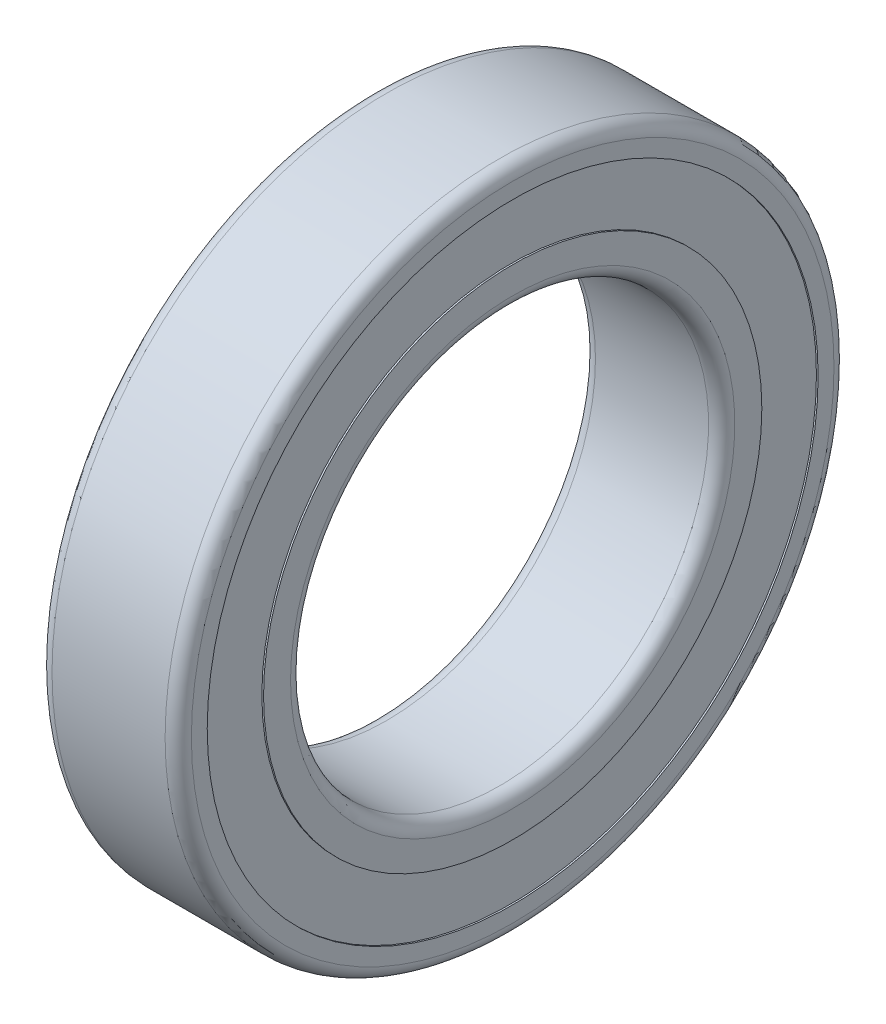
ISO-10303-21;
HEADER;
FILE_DESCRIPTION(('STEP AP214'),'2;1');
FILE_NAME('part.step','',(''),(''),'','','');
FILE_SCHEMA(('AUTOMOTIVE_DESIGN { 1 0 10303 214 1 1 1 1 }'));
ENDSEC;
DATA;
#1=APPLICATION_CONTEXT('core data for automotive mechanical design processes');
#2=APPLICATION_PROTOCOL_DEFINITION('international standard','automotive_design',2000,#1);
#3=PRODUCT_CONTEXT('',#1,'mechanical');
#4=PRODUCT('Part','Part','',(#3));
#5=PRODUCT_RELATED_PRODUCT_CATEGORY('part','',(#4));
#6=PRODUCT_DEFINITION_FORMATION('','',#4);
#7=PRODUCT_DEFINITION_CONTEXT('part definition',#1,'design');
#8=PRODUCT_DEFINITION('design','',#6,#7);
#9=PRODUCT_DEFINITION_SHAPE('','',#8);
#10=(LENGTH_UNIT() NAMED_UNIT(*) SI_UNIT(.MILLI.,.METRE.));
#11=(NAMED_UNIT(*) PLANE_ANGLE_UNIT() SI_UNIT($,.RADIAN.));
#12=(NAMED_UNIT(*) SI_UNIT($,.STERADIAN.) SOLID_ANGLE_UNIT());
#13=UNCERTAINTY_MEASURE_WITH_UNIT(LENGTH_MEASURE(1.E-05),#10,'distance_accuracy_value','');
#14=(GEOMETRIC_REPRESENTATION_CONTEXT(3) GLOBAL_UNCERTAINTY_ASSIGNED_CONTEXT((#13)) GLOBAL_UNIT_ASSIGNED_CONTEXT((#10,
#11,#12)) REPRESENTATION_CONTEXT('',''));
#15=CARTESIAN_POINT('',(0.,0.,0.));
#16=DIRECTION('',(0.,0.,1.));
#17=DIRECTION('',(1.,0.,0.));
#18=AXIS2_PLACEMENT_3D('',#15,#16,#17);
#19=CARTESIAN_POINT('',(0.,8.63319625011885,4.53105092742663));
#20=DIRECTION('',(-1.,0.,0.));
#21=DIRECTION('',(0.,0.885456025653216,0.464723172043757));
#22=AXIS2_PLACEMENT_3D('',#19,#20,#21);
#23=SPHERICAL_SURFACE('',#22,1.3275);
#24=CARTESIAN_POINT('',(-1.3275,8.63319625011885,4.53105092742663));
#25=VERTEX_POINT('',#24);
#26=VERTEX_LOOP('',#25);
#27=FACE_BOUND('',#26,.T.);
#28=ADVANCED_FACE('F39',(#27),#23,.T.);
#29=CLOSED_SHELL('',(#28));
#30=MANIFOLD_SOLID_BREP('B2',#29);
#31=CARTESIAN_POINT('',(0.,5.53863128062887,8.02409269246308));
#32=DIRECTION('',(-1.,0.,0.));
#33=DIRECTION('',(0.,0.568064746731166,0.822983865893649));
#34=AXIS2_PLACEMENT_3D('',#31,#32,#33);
#35=SPHERICAL_SURFACE('',#34,1.3275);
#36=CARTESIAN_POINT('',(-1.3275,5.53863128062887,8.02409269246308));
#37=VERTEX_POINT('',#36);
#38=VERTEX_LOOP('',#37);
#39=FACE_BOUND('',#38,.T.);
#40=ADVANCED_FACE('F57',(#39),#35,.T.);
#41=CLOSED_SHELL('',(#40));
#42=MANIFOLD_SOLID_BREP('B6',#41);
#43=CARTESIAN_POINT('',(0.,1.1752326324895,9.67891152245602));
#44=DIRECTION('',(-1.,0.,0.));
#45=DIRECTION('',(0.,0.120536680255334,0.992708874098053));
#46=AXIS2_PLACEMENT_3D('',#43,#44,#45);
#47=SPHERICAL_SURFACE('',#46,1.3275);
#48=CARTESIAN_POINT('',(-1.3275,1.1752326324895,9.67891152245602));
#49=VERTEX_POINT('',#48);
#50=VERTEX_LOOP('',#49);
#51=FACE_BOUND('',#50,.T.);
#52=ADVANCED_FACE('F75',(#51),#47,.T.);
#53=CLOSED_SHELL('',(#52));
#54=MANIFOLD_SOLID_BREP('B35',#53);
#55=CARTESIAN_POINT('',(0.,-3.45739764866464,9.11640836618283));
#56=DIRECTION('',(-1.,0.,0.));
#57=DIRECTION('',(0.,-0.354604887042527,0.935016242685418));
#58=AXIS2_PLACEMENT_3D('',#55,#56,#57);
#59=SPHERICAL_SURFACE('',#58,1.3275);
#60=CARTESIAN_POINT('',(-1.3275,-3.45739764866464,9.11640836618283));
#61=VERTEX_POINT('',#60);
#62=VERTEX_LOOP('',#61);
#63=FACE_BOUND('',#62,.T.);
#64=ADVANCED_FACE('F93',(#63),#59,.T.);
#65=CLOSED_SHELL('',(#64));
#66=MANIFOLD_SOLID_BREP('B53',#65);
#67=CARTESIAN_POINT('',(0.,-7.29797979466818,6.46544591784782));
#68=DIRECTION('',(-1.,0.,0.));
#69=DIRECTION('',(0.,-0.748510748171095,0.663122658240802));
#70=AXIS2_PLACEMENT_3D('',#67,#68,#69);
#71=SPHERICAL_SURFACE('',#70,1.3275);
#72=CARTESIAN_POINT('',(-1.3275,-7.29797979466818,6.46544591784782));
#73=VERTEX_POINT('',#72);
#74=VERTEX_LOOP('',#73);
#75=FACE_BOUND('',#74,.T.);
#76=ADVANCED_FACE('F111',(#75),#71,.T.);
#77=CLOSED_SHELL('',(#76));
#78=MANIFOLD_SOLID_BREP('B71',#77);
#79=CARTESIAN_POINT('',(0.,-9.46668271990399,2.33332772680376));
#80=DIRECTION('',(-1.,0.,0.));
#81=DIRECTION('',(0.,-0.97094181742605,0.239315664287565));
#82=AXIS2_PLACEMENT_3D('',#79,#80,#81);
#83=SPHERICAL_SURFACE('',#82,1.3275);
#84=CARTESIAN_POINT('',(-1.3275,-9.46668271990399,2.33332772680376));
#85=VERTEX_POINT('',#84);
#86=VERTEX_LOOP('',#85);
#87=FACE_BOUND('',#86,.T.);
#88=ADVANCED_FACE('F129',(#87),#83,.T.);
#89=CLOSED_SHELL('',(#88));
#90=MANIFOLD_SOLID_BREP('B89',#89);
#91=CARTESIAN_POINT('',(0.,-9.46668271990402,-2.33332772680363));
#92=DIRECTION('',(-1.,0.,0.));
#93=DIRECTION('',(0.,-0.970941817426054,-0.239315664287552));
#94=AXIS2_PLACEMENT_3D('',#91,#92,#93);
#95=SPHERICAL_SURFACE('',#94,1.3275);
#96=CARTESIAN_POINT('',(-1.3275,-9.46668271990402,-2.33332772680363));
#97=VERTEX_POINT('',#96);
#98=VERTEX_LOOP('',#97);
#99=FACE_BOUND('',#98,.T.);
#100=ADVANCED_FACE('F147',(#99),#95,.T.);
#101=CLOSED_SHELL('',(#100));
#102=MANIFOLD_SOLID_BREP('B107',#101);
#103=CARTESIAN_POINT('',(0.,-7.29797979466827,-6.46544591784771));
#104=DIRECTION('',(-1.,0.,0.));
#105=DIRECTION('',(0.,-0.748510748171105,-0.663122658240791));
#106=AXIS2_PLACEMENT_3D('',#103,#104,#105);
#107=SPHERICAL_SURFACE('',#106,1.3275);
#108=CARTESIAN_POINT('',(-1.3275,-7.29797979466827,-6.46544591784771));
#109=VERTEX_POINT('',#108);
#110=VERTEX_LOOP('',#109);
#111=FACE_BOUND('',#110,.T.);
#112=ADVANCED_FACE('F165',(#111),#107,.T.);
#113=CLOSED_SHELL('',(#112));
#114=MANIFOLD_SOLID_BREP('B125',#113);
#115=CARTESIAN_POINT('',(0.,-3.45739764866476,-9.11640836618278));
#116=DIRECTION('',(-1.,0.,0.));
#117=DIRECTION('',(0.,-0.35460488704254,-0.935016242685413));
#118=AXIS2_PLACEMENT_3D('',#115,#116,#117);
#119=SPHERICAL_SURFACE('',#118,1.3275);
#120=CARTESIAN_POINT('',(-1.3275,-3.45739764866476,-9.11640836618278));
#121=VERTEX_POINT('',#120);
#122=VERTEX_LOOP('',#121);
#123=FACE_BOUND('',#122,.T.);
#124=ADVANCED_FACE('F183',(#123),#119,.T.);
#125=CLOSED_SHELL('',(#124));
#126=MANIFOLD_SOLID_BREP('B143',#125);
#127=CARTESIAN_POINT('',(0.,1.17523263248937,-9.67891152245603));
#128=DIRECTION('',(-1.,0.,0.));
#129=DIRECTION('',(0.,0.12053668025532,-0.992708874098054));
#130=AXIS2_PLACEMENT_3D('',#127,#128,#129);
#131=SPHERICAL_SURFACE('',#130,1.3275);
#132=CARTESIAN_POINT('',(-1.3275,1.17523263248937,-9.67891152245603));
#133=VERTEX_POINT('',#132);
#134=VERTEX_LOOP('',#133);
#135=FACE_BOUND('',#134,.T.);
#136=ADVANCED_FACE('F201',(#135),#131,.T.);
#137=CLOSED_SHELL('',(#136));
#138=MANIFOLD_SOLID_BREP('B161',#137);
#139=CARTESIAN_POINT('',(0.,5.53863128062875,-8.02409269246316));
#140=DIRECTION('',(-1.,0.,0.));
#141=DIRECTION('',(0.,0.568064746731154,-0.822983865893658));
#142=AXIS2_PLACEMENT_3D('',#139,#140,#141);
#143=SPHERICAL_SURFACE('',#142,1.3275);
#144=CARTESIAN_POINT('',(-1.3275,5.53863128062875,-8.02409269246316));
#145=VERTEX_POINT('',#144);
#146=VERTEX_LOOP('',#145);
#147=FACE_BOUND('',#146,.T.);
#148=ADVANCED_FACE('F219',(#147),#143,.T.);
#149=CLOSED_SHELL('',(#148));
#150=MANIFOLD_SOLID_BREP('B179',#149);
#151=CARTESIAN_POINT('',(0.,8.63319625011879,-4.53105092742675));
#152=DIRECTION('',(-1.,0.,0.));
#153=DIRECTION('',(0.,0.885456025653209,-0.46472317204377));
#154=AXIS2_PLACEMENT_3D('',#151,#152,#153);
#155=SPHERICAL_SURFACE('',#154,1.3275);
#156=CARTESIAN_POINT('',(-1.3275,8.63319625011879,-4.53105092742675));
#157=VERTEX_POINT('',#156);
#158=VERTEX_LOOP('',#157);
#159=FACE_BOUND('',#158,.T.);
#160=ADVANCED_FACE('F237',(#159),#155,.T.);
#161=CLOSED_SHELL('',(#160));
#162=MANIFOLD_SOLID_BREP('B197',#161);
#163=CARTESIAN_POINT('',(0.,9.75,0.));
#164=DIRECTION('',(-1.,0.,0.));
#165=DIRECTION('',(0.,1.,0.));
#166=AXIS2_PLACEMENT_3D('',#163,#164,#165);
#167=SPHERICAL_SURFACE('',#166,1.3275);
#168=CARTESIAN_POINT('',(-1.3275,9.75,0.));
#169=VERTEX_POINT('',#168);
#170=VERTEX_LOOP('',#169);
#171=FACE_BOUND('',#170,.T.);
#172=ADVANCED_FACE('F257',(#171),#167,.T.);
#173=CLOSED_SHELL('',(#172));
#174=MANIFOLD_SOLID_BREP('B215',#173);
#175=CARTESIAN_POINT('',(-2.44,8.94,0.));
#176=DIRECTION('',(1.,0.,0.));
#177=DIRECTION('',(0.,0.,-1.));
#178=AXIS2_PLACEMENT_3D('',#175,#176,#177);
#179=PLANE('',#178);
#180=CARTESIAN_POINT('',(-2.44,0.,0.));
#181=DIRECTION('',(-1.,0.,0.));
#182=DIRECTION('',(0.,0.,1.));
#183=AXIS2_PLACEMENT_3D('',#180,#181,#182);
#184=CIRCLE('',#183,8.94);
#185=CARTESIAN_POINT('',(-2.44,0.,8.94));
#186=VERTEX_POINT('',#185);
#187=EDGE_CURVE('E291',#186,#186,#184,.T.);
#188=ORIENTED_EDGE('',*,*,#187,.F.);
#189=EDGE_LOOP('',(#188));
#190=FACE_BOUND('',#189,.T.);
#191=CARTESIAN_POINT('',(-2.44,0.,0.));
#192=DIRECTION('',(-1.,0.,0.));
#193=DIRECTION('',(0.,0.,1.));
#194=AXIS2_PLACEMENT_3D('',#191,#192,#193);
#195=CIRCLE('',#194,10.96);
#196=CARTESIAN_POINT('',(-2.44,0.,10.96));
#197=VERTEX_POINT('',#196);
#198=EDGE_CURVE('E256',#197,#197,#195,.T.);
#199=ORIENTED_EDGE('',*,*,#198,.T.);
#200=EDGE_LOOP('',(#199));
#201=FACE_BOUND('',#200,.T.);
#202=ADVANCED_FACE('F277',(#190,#201),#179,.F.);
#203=CARTESIAN_POINT('',(0.,0.,0.));
#204=DIRECTION('',(-1.,0.,0.));
#205=DIRECTION('',(0.,0.,1.));
#206=AXIS2_PLACEMENT_3D('',#203,#204,#205);
#207=CYLINDRICAL_SURFACE('',#206,10.96);
#208=ORIENTED_EDGE('',*,*,#198,.F.);
#209=EDGE_LOOP('',(#208));
#210=FACE_BOUND('',#209,.T.);
#211=CARTESIAN_POINT('',(-2.27,0.,0.));
#212=DIRECTION('',(-1.,0.,0.));
#213=DIRECTION('',(0.,0.,1.));
#214=AXIS2_PLACEMENT_3D('',#211,#212,#213);
#215=CIRCLE('',#214,10.96);
#216=CARTESIAN_POINT('',(-2.27,0.,10.96));
#217=VERTEX_POINT('',#216);
#218=EDGE_CURVE('E283',#217,#217,#215,.T.);
#219=ORIENTED_EDGE('',*,*,#218,.T.);
#220=EDGE_LOOP('',(#219));
#221=FACE_BOUND('',#220,.T.);
#222=ADVANCED_FACE('F300',(#210,#221),#207,.T.);
#223=CARTESIAN_POINT('',(-2.27,10.96,0.));
#224=DIRECTION('',(-1.,0.,0.));
#225=DIRECTION('',(0.,0.,1.));
#226=AXIS2_PLACEMENT_3D('',#223,#224,#225);
#227=PLANE('',#226);
#228=ORIENTED_EDGE('',*,*,#218,.F.);
#229=EDGE_LOOP('',(#228));
#230=FACE_BOUND('',#229,.T.);
#231=CARTESIAN_POINT('',(-2.27,0.,0.));
#232=DIRECTION('',(-1.,0.,0.));
#233=DIRECTION('',(0.,0.,1.));
#234=AXIS2_PLACEMENT_3D('',#231,#232,#233);
#235=CIRCLE('',#234,8.94);
#236=CARTESIAN_POINT('',(-2.27,0.,8.94));
#237=VERTEX_POINT('',#236);
#238=EDGE_CURVE('E287',#237,#237,#235,.T.);
#239=ORIENTED_EDGE('',*,*,#238,.T.);
#240=EDGE_LOOP('',(#239));
#241=FACE_BOUND('',#240,.T.);
#242=ADVANCED_FACE('F304',(#230,#241),#227,.F.);
#243=CARTESIAN_POINT('',(0.,0.,0.));
#244=DIRECTION('',(-1.,0.,0.));
#245=DIRECTION('',(0.,0.,1.));
#246=AXIS2_PLACEMENT_3D('',#243,#244,#245);
#247=CYLINDRICAL_SURFACE('',#246,8.94);
#248=ORIENTED_EDGE('',*,*,#238,.F.);
#249=EDGE_LOOP('',(#248));
#250=FACE_BOUND('',#249,.T.);
#251=ORIENTED_EDGE('',*,*,#187,.T.);
#252=EDGE_LOOP('',(#251));
#253=FACE_BOUND('',#252,.T.);
#254=ADVANCED_FACE('F297',(#250,#253),#247,.F.);
#255=CLOSED_SHELL('',(#202,#222,#242,#254));
#256=MANIFOLD_SOLID_BREP('B233',#255);
#257=CARTESIAN_POINT('',(0.,0.,0.));
#258=DIRECTION('',(-1.,0.,0.));
#259=DIRECTION('',(0.,0.,1.));
#260=AXIS2_PLACEMENT_3D('',#257,#258,#259);
#261=CYLINDRICAL_SURFACE('',#260,10.96);
#262=CARTESIAN_POINT('',(2.27,0.,0.));
#263=DIRECTION('',(-1.,0.,0.));
#264=DIRECTION('',(0.,0.,1.));
#265=AXIS2_PLACEMENT_3D('',#262,#263,#264);
#266=CIRCLE('',#265,10.96);
#267=CARTESIAN_POINT('',(2.27,0.,10.96));
#268=VERTEX_POINT('',#267);
#269=EDGE_CURVE('E276',#268,#268,#266,.T.);
#270=ORIENTED_EDGE('',*,*,#269,.F.);
#271=EDGE_LOOP('',(#270));
#272=FACE_BOUND('',#271,.T.);
#273=CARTESIAN_POINT('',(2.44,0.,0.));
#274=DIRECTION('',(-1.,0.,0.));
#275=DIRECTION('',(0.,0.,1.));
#276=AXIS2_PLACEMENT_3D('',#273,#274,#275);
#277=CIRCLE('',#276,10.96);
#278=CARTESIAN_POINT('',(2.44,0.,10.96));
#279=VERTEX_POINT('',#278);
#280=EDGE_CURVE('E364',#279,#279,#277,.T.);
#281=ORIENTED_EDGE('',*,*,#280,.T.);
#282=EDGE_LOOP('',(#281));
#283=FACE_BOUND('',#282,.T.);
#284=ADVANCED_FACE('F350',(#272,#283),#261,.T.);
#285=CARTESIAN_POINT('',(2.27,10.96,0.));
#286=DIRECTION('',(1.,0.,0.));
#287=DIRECTION('',(0.,0.,-1.));
#288=AXIS2_PLACEMENT_3D('',#285,#286,#287);
#289=PLANE('',#288);
#290=CARTESIAN_POINT('',(2.27,0.,0.));
#291=DIRECTION('',(-1.,0.,0.));
#292=DIRECTION('',(0.,0.,1.));
#293=AXIS2_PLACEMENT_3D('',#290,#291,#292);
#294=CIRCLE('',#293,8.94);
#295=CARTESIAN_POINT('',(2.27,0.,8.94));
#296=VERTEX_POINT('',#295);
#297=EDGE_CURVE('E356',#296,#296,#294,.T.);
#298=ORIENTED_EDGE('',*,*,#297,.F.);
#299=EDGE_LOOP('',(#298));
#300=FACE_BOUND('',#299,.T.);
#301=ORIENTED_EDGE('',*,*,#269,.T.);
#302=EDGE_LOOP('',(#301));
#303=FACE_BOUND('',#302,.T.);
#304=ADVANCED_FACE('F379',(#300,#303),#289,.F.);
#305=CARTESIAN_POINT('',(0.,0.,0.));
#306=DIRECTION('',(-1.,0.,0.));
#307=DIRECTION('',(0.,0.,1.));
#308=AXIS2_PLACEMENT_3D('',#305,#306,#307);
#309=CYLINDRICAL_SURFACE('',#308,8.94);
#310=CARTESIAN_POINT('',(2.44,0.,0.));
#311=DIRECTION('',(-1.,0.,0.));
#312=DIRECTION('',(0.,0.,1.));
#313=AXIS2_PLACEMENT_3D('',#310,#311,#312);
#314=CIRCLE('',#313,8.94);
#315=CARTESIAN_POINT('',(2.44,0.,8.94));
#316=VERTEX_POINT('',#315);
#317=EDGE_CURVE('E360',#316,#316,#314,.T.);
#318=ORIENTED_EDGE('',*,*,#317,.F.);
#319=EDGE_LOOP('',(#318));
#320=FACE_BOUND('',#319,.T.);
#321=ORIENTED_EDGE('',*,*,#297,.T.);
#322=EDGE_LOOP('',(#321));
#323=FACE_BOUND('',#322,.T.);
#324=ADVANCED_FACE('F374',(#320,#323),#309,.F.);
#325=CARTESIAN_POINT('',(2.44,8.94,0.));
#326=DIRECTION('',(-1.,0.,0.));
#327=DIRECTION('',(0.,0.,1.));
#328=AXIS2_PLACEMENT_3D('',#325,#326,#327);
#329=PLANE('',#328);
#330=ORIENTED_EDGE('',*,*,#280,.F.);
#331=EDGE_LOOP('',(#330));
#332=FACE_BOUND('',#331,.T.);
#333=ORIENTED_EDGE('',*,*,#317,.T.);
#334=EDGE_LOOP('',(#333));
#335=FACE_BOUND('',#334,.T.);
#336=ADVANCED_FACE('F371',(#332,#335),#329,.F.);
#337=CLOSED_SHELL('',(#284,#304,#324,#336));
#338=MANIFOLD_SOLID_BREP('B251',#337);
#339=CARTESIAN_POINT('',(0.,0.,0.));
#340=DIRECTION('',(-1.,0.,0.));
#341=DIRECTION('',(0.,0.,1.));
#342=AXIS2_PLACEMENT_3D('',#339,#340,#341);
#343=TOROIDAL_SURFACE('',#342,9.75,1.35);
#344=CARTESIAN_POINT('',(-1.08,0.,0.));
#345=DIRECTION('',(-1.,0.,0.));
#346=DIRECTION('',(0.,0.,1.));
#347=AXIS2_PLACEMENT_3D('',#344,#345,#346);
#348=CIRCLE('',#347,8.94);
#349=CARTESIAN_POINT('',(-1.08,0.,8.94));
#350=VERTEX_POINT('',#349);
#351=EDGE_CURVE('E442',#350,#350,#348,.T.);
#352=ORIENTED_EDGE('',*,*,#351,.F.);
#353=EDGE_LOOP('',(#352));
#354=FACE_BOUND('',#353,.T.);
#355=CARTESIAN_POINT('',(1.08,0.,0.));
#356=DIRECTION('',(-1.,0.,0.));
#357=DIRECTION('',(0.,0.,1.));
#358=AXIS2_PLACEMENT_3D('',#355,#356,#357);
#359=CIRCLE('',#358,8.94);
#360=CARTESIAN_POINT('',(1.08,0.,8.94));
#361=VERTEX_POINT('',#360);
#362=EDGE_CURVE('E451',#361,#361,#359,.T.);
#363=ORIENTED_EDGE('',*,*,#362,.T.);
#364=EDGE_LOOP('',(#363));
#365=FACE_BOUND('',#364,.T.);
#366=ADVANCED_FACE('F422',(#354,#365),#343,.F.);
#367=CARTESIAN_POINT('',(0.,0.,0.));
#368=DIRECTION('',(-1.,0.,0.));
#369=DIRECTION('',(0.,0.,1.));
#370=AXIS2_PLACEMENT_3D('',#367,#368,#369);
#371=CYLINDRICAL_SURFACE('',#370,8.94);
#372=CARTESIAN_POINT('',(-2.5,0.,0.));
#373=DIRECTION('',(-1.,0.,0.));
#374=DIRECTION('',(0.,0.,1.));
#375=AXIS2_PLACEMENT_3D('',#372,#373,#374);
#376=CIRCLE('',#375,8.94);
#377=CARTESIAN_POINT('',(-2.5,0.,8.94));
#378=VERTEX_POINT('',#377);
#379=EDGE_CURVE('E445',#378,#378,#376,.T.);
#380=ORIENTED_EDGE('',*,*,#379,.F.);
#381=EDGE_LOOP('',(#380));
#382=FACE_BOUND('',#381,.T.);
#383=ORIENTED_EDGE('',*,*,#351,.T.);
#384=EDGE_LOOP('',(#383));
#385=FACE_BOUND('',#384,.T.);
#386=ADVANCED_FACE('F474',(#382,#385),#371,.T.);
#387=CARTESIAN_POINT('',(-2.5,8.94,0.));
#388=DIRECTION('',(1.,0.,0.));
#389=DIRECTION('',(0.,0.,-1.));
#390=AXIS2_PLACEMENT_3D('',#387,#388,#389);
#391=PLANE('',#390);
#392=CARTESIAN_POINT('',(-2.5,0.,0.));
#393=DIRECTION('',(1.,0.,0.));
#394=DIRECTION('',(0.,0.,-1.));
#395=AXIS2_PLACEMENT_3D('',#392,#393,#394);
#396=CIRCLE('',#395,7.9712);
#397=CARTESIAN_POINT('',(-2.5,0.,-7.9712));
#398=VERTEX_POINT('',#397);
#399=EDGE_CURVE('E429',#398,#398,#396,.T.);
#400=ORIENTED_EDGE('',*,*,#399,.T.);
#401=EDGE_LOOP('',(#400));
#402=FACE_BOUND('',#401,.T.);
#403=ORIENTED_EDGE('',*,*,#379,.T.);
#404=EDGE_LOOP('',(#403));
#405=FACE_BOUND('',#404,.T.);
#406=ADVANCED_FACE('F470',(#402,#405),#391,.F.);
#407=CARTESIAN_POINT('',(0.,0.,0.));
#408=DIRECTION('',(-1.,0.,0.));
#409=DIRECTION('',(0.,0.,1.));
#410=AXIS2_PLACEMENT_3D('',#407,#408,#409);
#411=CYLINDRICAL_SURFACE('',#410,7.5);
#412=CARTESIAN_POINT('',(-2.0288,0.,-3.33066907387547E-13));
#413=DIRECTION('',(1.,0.,0.));
#414=DIRECTION('',(0.,0.,-1.));
#415=AXIS2_PLACEMENT_3D('',#412,#413,#414);
#416=CIRCLE('',#415,7.5);
#417=CARTESIAN_POINT('',(-2.0288,0.,-7.50000000000033));
#418=VERTEX_POINT('',#417);
#419=EDGE_CURVE('E433',#418,#418,#416,.F.);
#420=ORIENTED_EDGE('',*,*,#419,.T.);
#421=EDGE_LOOP('',(#420));
#422=FACE_BOUND('',#421,.T.);
#423=CARTESIAN_POINT('',(2.0288,0.,0.));
#424=DIRECTION('',(-1.,0.,0.));
#425=DIRECTION('',(0.,0.,1.));
#426=AXIS2_PLACEMENT_3D('',#423,#424,#425);
#427=CIRCLE('',#426,7.5);
#428=CARTESIAN_POINT('',(2.0288,0.,7.5));
#429=VERTEX_POINT('',#428);
#430=EDGE_CURVE('E437',#429,#429,#427,.F.);
#431=ORIENTED_EDGE('',*,*,#430,.T.);
#432=EDGE_LOOP('',(#431));
#433=FACE_BOUND('',#432,.T.);
#434=ADVANCED_FACE('F465',(#422,#433),#411,.F.);
#435=CARTESIAN_POINT('',(2.5,8.94,0.));
#436=DIRECTION('',(-1.,0.,0.));
#437=DIRECTION('',(0.,0.,1.));
#438=AXIS2_PLACEMENT_3D('',#435,#436,#437);
#439=PLANE('',#438);
#440=CARTESIAN_POINT('',(2.5,0.,0.));
#441=DIRECTION('',(-1.,0.,0.));
#442=DIRECTION('',(0.,0.,1.));
#443=AXIS2_PLACEMENT_3D('',#440,#441,#442);
#444=CIRCLE('',#443,7.9712);
#445=CARTESIAN_POINT('',(2.5,0.,7.9712));
#446=VERTEX_POINT('',#445);
#447=EDGE_CURVE('E349',#446,#446,#444,.T.);
#448=ORIENTED_EDGE('',*,*,#447,.T.);
#449=EDGE_LOOP('',(#448));
#450=FACE_BOUND('',#449,.T.);
#451=CARTESIAN_POINT('',(2.5,0.,0.));
#452=DIRECTION('',(-1.,0.,0.));
#453=DIRECTION('',(0.,0.,1.));
#454=AXIS2_PLACEMENT_3D('',#451,#452,#453);
#455=CIRCLE('',#454,8.94);
#456=CARTESIAN_POINT('',(2.5,0.,8.94));
#457=VERTEX_POINT('',#456);
#458=EDGE_CURVE('E448',#457,#457,#455,.T.);
#459=ORIENTED_EDGE('',*,*,#458,.F.);
#460=EDGE_LOOP('',(#459));
#461=FACE_BOUND('',#460,.T.);
#462=ADVANCED_FACE('F460',(#450,#461),#439,.F.);
#463=CARTESIAN_POINT('',(0.,0.,0.));
#464=DIRECTION('',(-1.,0.,0.));
#465=DIRECTION('',(0.,0.,1.));
#466=AXIS2_PLACEMENT_3D('',#463,#464,#465);
#467=CYLINDRICAL_SURFACE('',#466,8.94);
#468=ORIENTED_EDGE('',*,*,#362,.F.);
#469=EDGE_LOOP('',(#468));
#470=FACE_BOUND('',#469,.T.);
#471=ORIENTED_EDGE('',*,*,#458,.T.);
#472=EDGE_LOOP('',(#471));
#473=FACE_BOUND('',#472,.T.);
#474=ADVANCED_FACE('F456',(#470,#473),#467,.T.);
#475=CARTESIAN_POINT('',(-2.0288,0.,-3.33066907387547E-13));
#476=DIRECTION('',(1.,0.,0.));
#477=DIRECTION('',(0.,0.,-1.));
#478=AXIS2_PLACEMENT_3D('',#475,#476,#477);
#479=TOROIDAL_SURFACE('',#478,7.9712,0.4712);
#480=ORIENTED_EDGE('',*,*,#399,.F.);
#481=EDGE_LOOP('',(#480));
#482=FACE_BOUND('',#481,.T.);
#483=ORIENTED_EDGE('',*,*,#419,.F.);
#484=EDGE_LOOP('',(#483));
#485=FACE_BOUND('',#484,.T.);
#486=ADVANCED_FACE('F459',(#482,#485),#479,.T.);
#487=CARTESIAN_POINT('',(2.0288,0.,0.));
#488=DIRECTION('',(-1.,0.,0.));
#489=DIRECTION('',(0.,0.,1.));
#490=AXIS2_PLACEMENT_3D('',#487,#488,#489);
#491=TOROIDAL_SURFACE('',#490,7.9712,0.4712);
#492=ORIENTED_EDGE('',*,*,#430,.F.);
#493=EDGE_LOOP('',(#492));
#494=FACE_BOUND('',#493,.T.);
#495=ORIENTED_EDGE('',*,*,#447,.F.);
#496=EDGE_LOOP('',(#495));
#497=FACE_BOUND('',#496,.T.);
#498=ADVANCED_FACE('F424',(#494,#497),#491,.T.);
#499=CLOSED_SHELL('',(#366,#386,#406,#434,#462,#474,#486,#498));
#500=MANIFOLD_SOLID_BREP('B271',#499);
#501=CARTESIAN_POINT('',(-2.5,12.,0.));
#502=DIRECTION('',(1.,0.,0.));
#503=DIRECTION('',(0.,0.,-1.));
#504=AXIS2_PLACEMENT_3D('',#501,#502,#503);
#505=PLANE('',#504);
#506=CARTESIAN_POINT('',(-2.5,0.,0.));
#507=DIRECTION('',(1.,0.,0.));
#508=DIRECTION('',(0.,0.,-1.));
#509=AXIS2_PLACEMENT_3D('',#506,#507,#508);
#510=CIRCLE('',#509,11.5288);
#511=CARTESIAN_POINT('',(-2.5,0.,-11.5288));
#512=VERTEX_POINT('',#511);
#513=EDGE_CURVE('E421',#512,#512,#510,.F.);
#514=ORIENTED_EDGE('',*,*,#513,.T.);
#515=EDGE_LOOP('',(#514));
#516=FACE_BOUND('',#515,.T.);
#517=CARTESIAN_POINT('',(-2.5,0.,0.));
#518=DIRECTION('',(-1.,0.,0.));
#519=DIRECTION('',(0.,0.,1.));
#520=AXIS2_PLACEMENT_3D('',#517,#518,#519);
#521=CIRCLE('',#520,10.96);
#522=CARTESIAN_POINT('',(-2.5,0.,10.96));
#523=VERTEX_POINT('',#522);
#524=EDGE_CURVE('E563',#523,#523,#521,.T.);
#525=ORIENTED_EDGE('',*,*,#524,.F.);
#526=EDGE_LOOP('',(#525));
#527=FACE_BOUND('',#526,.T.);
#528=ADVANCED_FACE('F543',(#516,#527),#505,.F.);
#529=CARTESIAN_POINT('',(0.,0.,0.));
#530=DIRECTION('',(-1.,0.,0.));
#531=DIRECTION('',(0.,0.,1.));
#532=AXIS2_PLACEMENT_3D('',#529,#530,#531);
#533=CYLINDRICAL_SURFACE('',#532,10.96);
#534=CARTESIAN_POINT('',(-2.26999999999999,0.,-1.49880108324396E-12));
#535=DIRECTION('',(-1.,0.,0.));
#536=DIRECTION('',(0.,0.,1.));
#537=AXIS2_PLACEMENT_3D('',#534,#535,#536);
#538=CIRCLE('',#537,10.96);
#539=CARTESIAN_POINT('',(-2.26999999999999,0.,10.9599999999985));
#540=VERTEX_POINT('',#539);
#541=EDGE_CURVE('E566',#540,#540,#538,.T.);
#542=ORIENTED_EDGE('',*,*,#541,.F.);
#543=EDGE_LOOP('',(#542));
#544=FACE_BOUND('',#543,.T.);
#545=ORIENTED_EDGE('',*,*,#524,.T.);
#546=EDGE_LOOP('',(#545));
#547=FACE_BOUND('',#546,.T.);
#548=ADVANCED_FACE('F623',(#544,#547),#533,.F.);
#549=CARTESIAN_POINT('',(-2.26999999999999,10.96,-1.49880108324396E-12));
#550=DIRECTION('',(1.,0.,0.));
#551=DIRECTION('',(0.,0.,-1.));
#552=AXIS2_PLACEMENT_3D('',#549,#550,#551);
#553=PLANE('',#552);
#554=CARTESIAN_POINT('',(-2.26999999999999,0.,-1.49880108324396E-12));
#555=DIRECTION('',(-1.,0.,0.));
#556=DIRECTION('',(0.,0.,1.));
#557=AXIS2_PLACEMENT_3D('',#554,#555,#556);
#558=CIRCLE('',#557,10.56);
#559=CARTESIAN_POINT('',(-2.26999999999999,0.,10.5599999999985));
#560=VERTEX_POINT('',#559);
#561=EDGE_CURVE('E569',#560,#560,#558,.T.);
#562=ORIENTED_EDGE('',*,*,#561,.F.);
#563=EDGE_LOOP('',(#562));
#564=FACE_BOUND('',#563,.T.);
#565=ORIENTED_EDGE('',*,*,#541,.T.);
#566=EDGE_LOOP('',(#565));
#567=FACE_BOUND('',#566,.T.);
#568=ADVANCED_FACE('F617',(#564,#567),#553,.F.);
#569=CARTESIAN_POINT('',(0.,0.,0.));
#570=DIRECTION('',(-1.,0.,0.));
#571=DIRECTION('',(0.,0.,1.));
#572=AXIS2_PLACEMENT_3D('',#569,#570,#571);
#573=CYLINDRICAL_SURFACE('',#572,10.56);
#574=CARTESIAN_POINT('',(-1.08,0.,0.));
#575=DIRECTION('',(-1.,0.,0.));
#576=DIRECTION('',(0.,0.,1.));
#577=AXIS2_PLACEMENT_3D('',#574,#575,#576);
#578=CIRCLE('',#577,10.56);
#579=CARTESIAN_POINT('',(-1.08,0.,10.56));
#580=VERTEX_POINT('',#579);
#581=EDGE_CURVE('E572',#580,#580,#578,.T.);
#582=ORIENTED_EDGE('',*,*,#581,.F.);
#583=EDGE_LOOP('',(#582));
#584=FACE_BOUND('',#583,.T.);
#585=ORIENTED_EDGE('',*,*,#561,.T.);
#586=EDGE_LOOP('',(#585));
#587=FACE_BOUND('',#586,.T.);
#588=ADVANCED_FACE('F611',(#584,#587),#573,.F.);
#589=CARTESIAN_POINT('',(0.,0.,0.));
#590=DIRECTION('',(-1.,0.,0.));
#591=DIRECTION('',(0.,0.,1.));
#592=AXIS2_PLACEMENT_3D('',#589,#590,#591);
#593=TOROIDAL_SURFACE('',#592,9.75,1.35);
#594=CARTESIAN_POINT('',(1.08,0.,0.));
#595=DIRECTION('',(-1.,0.,0.));
#596=DIRECTION('',(0.,0.,1.));
#597=AXIS2_PLACEMENT_3D('',#594,#595,#596);
#598=CIRCLE('',#597,10.56);
#599=CARTESIAN_POINT('',(1.08,0.,10.56));
#600=VERTEX_POINT('',#599);
#601=EDGE_CURVE('E575',#600,#600,#598,.T.);
#602=ORIENTED_EDGE('',*,*,#601,.F.);
#603=EDGE_LOOP('',(#602));
#604=FACE_BOUND('',#603,.T.);
#605=ORIENTED_EDGE('',*,*,#581,.T.);
#606=EDGE_LOOP('',(#605));
#607=FACE_BOUND('',#606,.T.);
#608=ADVANCED_FACE('F605',(#604,#607),#593,.F.);
#609=CARTESIAN_POINT('',(0.,0.,0.));
#610=DIRECTION('',(-1.,0.,0.));
#611=DIRECTION('',(0.,0.,1.));
#612=AXIS2_PLACEMENT_3D('',#609,#610,#611);
#613=CYLINDRICAL_SURFACE('',#612,10.56);
#614=CARTESIAN_POINT('',(2.26999999999999,0.,0.));
#615=DIRECTION('',(-1.,0.,0.));
#616=DIRECTION('',(0.,0.,1.));
#617=AXIS2_PLACEMENT_3D('',#614,#615,#616);
#618=CIRCLE('',#617,10.56);
#619=CARTESIAN_POINT('',(2.26999999999999,0.,10.56));
#620=VERTEX_POINT('',#619);
#621=EDGE_CURVE('E578',#620,#620,#618,.T.);
#622=ORIENTED_EDGE('',*,*,#621,.F.);
#623=EDGE_LOOP('',(#622));
#624=FACE_BOUND('',#623,.T.);
#625=ORIENTED_EDGE('',*,*,#601,.T.);
#626=EDGE_LOOP('',(#625));
#627=FACE_BOUND('',#626,.T.);
#628=ADVANCED_FACE('F599',(#624,#627),#613,.F.);
#629=CARTESIAN_POINT('',(2.26999999999999,10.96,0.));
#630=DIRECTION('',(-1.,0.,0.));
#631=DIRECTION('',(0.,0.,1.));
#632=AXIS2_PLACEMENT_3D('',#629,#630,#631);
#633=PLANE('',#632);
#634=CARTESIAN_POINT('',(2.26999999999999,0.,0.));
#635=DIRECTION('',(-1.,0.,0.));
#636=DIRECTION('',(0.,0.,1.));
#637=AXIS2_PLACEMENT_3D('',#634,#635,#636);
#638=CIRCLE('',#637,10.96);
#639=CARTESIAN_POINT('',(2.26999999999999,0.,10.96));
#640=VERTEX_POINT('',#639);
#641=EDGE_CURVE('E581',#640,#640,#638,.T.);
#642=ORIENTED_EDGE('',*,*,#641,.F.);
#643=EDGE_LOOP('',(#642));
#644=FACE_BOUND('',#643,.T.);
#645=ORIENTED_EDGE('',*,*,#621,.T.);
#646=EDGE_LOOP('',(#645));
#647=FACE_BOUND('',#646,.T.);
#648=ADVANCED_FACE('F593',(#644,#647),#633,.F.);
#649=CARTESIAN_POINT('',(0.,0.,0.));
#650=DIRECTION('',(-1.,0.,0.));
#651=DIRECTION('',(0.,0.,1.));
#652=AXIS2_PLACEMENT_3D('',#649,#650,#651);
#653=CYLINDRICAL_SURFACE('',#652,10.96);
#654=CARTESIAN_POINT('',(2.5,0.,0.));
#655=DIRECTION('',(-1.,0.,0.));
#656=DIRECTION('',(0.,0.,1.));
#657=AXIS2_PLACEMENT_3D('',#654,#655,#656);
#658=CIRCLE('',#657,10.96);
#659=CARTESIAN_POINT('',(2.5,0.,10.96));
#660=VERTEX_POINT('',#659);
#661=EDGE_CURVE('E584',#660,#660,#658,.T.);
#662=ORIENTED_EDGE('',*,*,#661,.F.);
#663=EDGE_LOOP('',(#662));
#664=FACE_BOUND('',#663,.T.);
#665=ORIENTED_EDGE('',*,*,#641,.T.);
#666=EDGE_LOOP('',(#665));
#667=FACE_BOUND('',#666,.T.);
#668=ADVANCED_FACE('F590',(#664,#667),#653,.F.);
#669=CARTESIAN_POINT('',(2.5,12.,0.));
#670=DIRECTION('',(-1.,0.,0.));
#671=DIRECTION('',(0.,0.,1.));
#672=AXIS2_PLACEMENT_3D('',#669,#670,#671);
#673=PLANE('',#672);
#674=CARTESIAN_POINT('',(2.5,0.,0.));
#675=DIRECTION('',(-1.,0.,0.));
#676=DIRECTION('',(0.,0.,1.));
#677=AXIS2_PLACEMENT_3D('',#674,#675,#676);
#678=CIRCLE('',#677,11.5288);
#679=CARTESIAN_POINT('',(2.5,0.,11.5288));
#680=VERTEX_POINT('',#679);
#681=EDGE_CURVE('E550',#680,#680,#678,.F.);
#682=ORIENTED_EDGE('',*,*,#681,.T.);
#683=EDGE_LOOP('',(#682));
#684=FACE_BOUND('',#683,.T.);
#685=ORIENTED_EDGE('',*,*,#661,.T.);
#686=EDGE_LOOP('',(#685));
#687=FACE_BOUND('',#686,.T.);
#688=ADVANCED_FACE('F588',(#684,#687),#673,.F.);
#689=CARTESIAN_POINT('',(0.,0.,0.));
#690=DIRECTION('',(-1.,0.,0.));
#691=DIRECTION('',(0.,0.,1.));
#692=AXIS2_PLACEMENT_3D('',#689,#690,#691);
#693=CYLINDRICAL_SURFACE('',#692,12.);
#694=CARTESIAN_POINT('',(2.0288,0.,0.));
#695=DIRECTION('',(-1.,0.,0.));
#696=DIRECTION('',(0.,0.,1.));
#697=AXIS2_PLACEMENT_3D('',#694,#695,#696);
#698=CIRCLE('',#697,12.);
#699=CARTESIAN_POINT('',(2.0288,0.,12.));
#700=VERTEX_POINT('',#699);
#701=EDGE_CURVE('E554',#700,#700,#698,.T.);
#702=ORIENTED_EDGE('',*,*,#701,.T.);
#703=EDGE_LOOP('',(#702));
#704=FACE_BOUND('',#703,.T.);
#705=CARTESIAN_POINT('',(-2.0288,0.,-1.49880108324396E-12));
#706=DIRECTION('',(1.,0.,0.));
#707=DIRECTION('',(0.,0.,-1.));
#708=AXIS2_PLACEMENT_3D('',#705,#706,#707);
#709=CIRCLE('',#708,12.);
#710=CARTESIAN_POINT('',(-2.0288,0.,-12.0000000000015));
#711=VERTEX_POINT('',#710);
#712=EDGE_CURVE('E558',#711,#711,#709,.T.);
#713=ORIENTED_EDGE('',*,*,#712,.T.);
#714=EDGE_LOOP('',(#713));
#715=FACE_BOUND('',#714,.T.);
#716=ADVANCED_FACE('F638',(#704,#715),#693,.T.);
#717=CARTESIAN_POINT('',(2.0288,0.,0.));
#718=DIRECTION('',(-1.,0.,0.));
#719=DIRECTION('',(0.,0.,1.));
#720=AXIS2_PLACEMENT_3D('',#717,#718,#719);
#721=TOROIDAL_SURFACE('',#720,11.5288,0.4712);
#722=ORIENTED_EDGE('',*,*,#681,.F.);
#723=EDGE_LOOP('',(#722));
#724=FACE_BOUND('',#723,.T.);
#725=ORIENTED_EDGE('',*,*,#701,.F.);
#726=EDGE_LOOP('',(#725));
#727=FACE_BOUND('',#726,.T.);
#728=ADVANCED_FACE('F636',(#724,#727),#721,.T.);
#729=CARTESIAN_POINT('',(-2.0288,0.,-1.49880108324396E-12));
#730=DIRECTION('',(1.,0.,0.));
#731=DIRECTION('',(0.,0.,-1.));
#732=AXIS2_PLACEMENT_3D('',#729,#730,#731);
#733=TOROIDAL_SURFACE('',#732,11.5288,0.4712);
#734=ORIENTED_EDGE('',*,*,#712,.F.);
#735=EDGE_LOOP('',(#734));
#736=FACE_BOUND('',#735,.T.);
#737=ORIENTED_EDGE('',*,*,#513,.F.);
#738=EDGE_LOOP('',(#737));
#739=FACE_BOUND('',#738,.T.);
#740=ADVANCED_FACE('F545',(#736,#739),#733,.T.);
#741=CLOSED_SHELL('',(#528,#548,#568,#588,#608,#628,#648,#668,#688,#716,#728,#740));
#742=MANIFOLD_SOLID_BREP('B344',#741);
#743=ADVANCED_BREP_SHAPE_REPRESENTATION('',(#18,#30,#42,#54,#66,#78,#90,#102,#114,#126,#138,
#150,#162,#174,#256,#338,#500,#742),#14);
#744=SHAPE_DEFINITION_REPRESENTATION(#9,#743);
ENDSEC;
END-ISO-10303-21;
